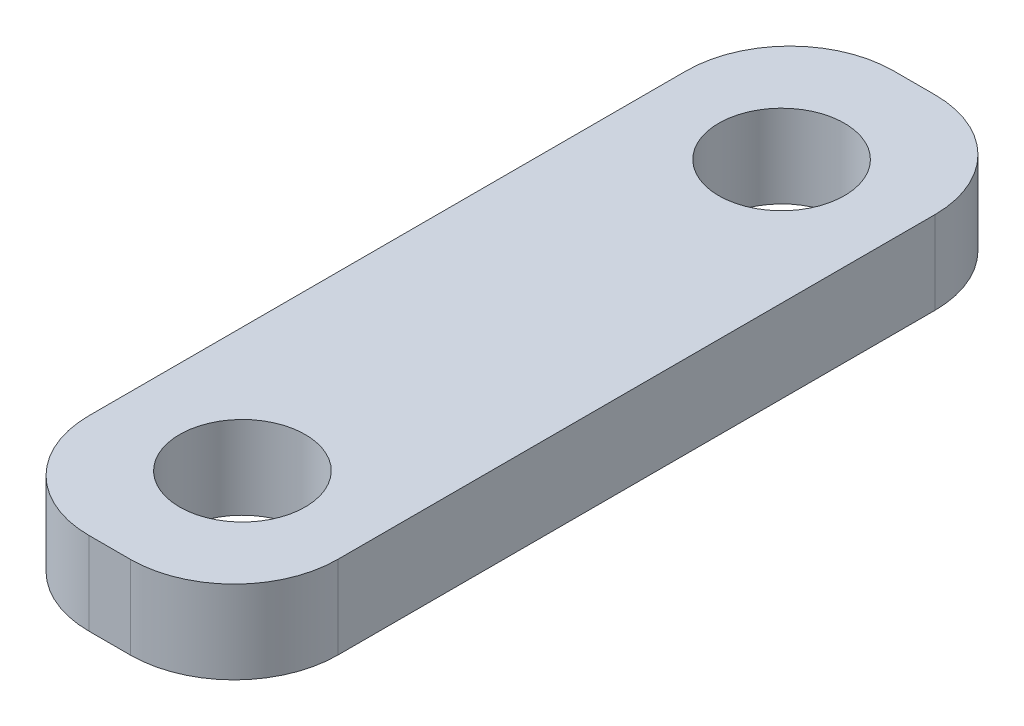
ISO-10303-21;
HEADER;
FILE_DESCRIPTION(('STEP AP214'),'2;1');
FILE_NAME('part.step','',(''),(''),'','','');
FILE_SCHEMA(('AUTOMOTIVE_DESIGN { 1 0 10303 214 1 1 1 1 }'));
ENDSEC;
DATA;
#1=APPLICATION_CONTEXT('core data for automotive mechanical design processes');
#2=APPLICATION_PROTOCOL_DEFINITION('international standard','automotive_design',2000,#1);
#3=PRODUCT_CONTEXT('',#1,'mechanical');
#4=PRODUCT('Part','Part','',(#3));
#5=PRODUCT_RELATED_PRODUCT_CATEGORY('part','',(#4));
#6=PRODUCT_DEFINITION_FORMATION('','',#4);
#7=PRODUCT_DEFINITION_CONTEXT('part definition',#1,'design');
#8=PRODUCT_DEFINITION('design','',#6,#7);
#9=PRODUCT_DEFINITION_SHAPE('','',#8);
#10=(LENGTH_UNIT() NAMED_UNIT(*) SI_UNIT(.MILLI.,.METRE.));
#11=(NAMED_UNIT(*) PLANE_ANGLE_UNIT() SI_UNIT($,.RADIAN.));
#12=(NAMED_UNIT(*) SI_UNIT($,.STERADIAN.) SOLID_ANGLE_UNIT());
#13=UNCERTAINTY_MEASURE_WITH_UNIT(LENGTH_MEASURE(1.E-05),#10,'distance_accuracy_value','');
#14=(GEOMETRIC_REPRESENTATION_CONTEXT(3) GLOBAL_UNCERTAINTY_ASSIGNED_CONTEXT((#13)) GLOBAL_UNIT_ASSIGNED_CONTEXT((#10,
#11,#12)) REPRESENTATION_CONTEXT('',''));
#15=CARTESIAN_POINT('',(0.,0.,0.));
#16=DIRECTION('',(0.,0.,1.));
#17=DIRECTION('',(1.,0.,0.));
#18=AXIS2_PLACEMENT_3D('',#15,#16,#17);
#19=CARTESIAN_POINT('',(0.,2.,0.));
#20=DIRECTION('',(0.,-1.,0.));
#21=DIRECTION('',(0.,0.,-1.));
#22=AXIS2_PLACEMENT_3D('',#19,#20,#21);
#23=PLANE('',#22);
#24=DIRECTION('',(1.,0.,0.));
#25=VECTOR('',#24,1.);
#26=CARTESIAN_POINT('',(0.,2.,0.));
#27=LINE('',#26,#25);
#28=CARTESIAN_POINT('',(2.5,2.,0.));
#29=VERTEX_POINT('',#28);
#30=CARTESIAN_POINT('',(3.5,2.,0.));
#31=VERTEX_POINT('',#30);
#32=EDGE_CURVE('E176',#29,#31,#27,.T.);
#33=ORIENTED_EDGE('',*,*,#32,.T.);
#34=CARTESIAN_POINT('',(3.5,2.,-2.5));
#35=DIRECTION('',(0.,-1.,0.));
#36=DIRECTION('',(0.,0.,-1.));
#37=AXIS2_PLACEMENT_3D('',#34,#35,#36);
#38=CIRCLE('',#37,2.5);
#39=CARTESIAN_POINT('',(6.,2.,-2.5));
#40=VERTEX_POINT('',#39);
#41=EDGE_CURVE('E156',#31,#40,#38,.F.);
#42=ORIENTED_EDGE('',*,*,#41,.T.);
#43=DIRECTION('',(0.,0.,-1.));
#44=VECTOR('',#43,1.);
#45=CARTESIAN_POINT('',(6.,2.,0.));
#46=LINE('',#45,#44);
#47=CARTESIAN_POINT('',(6.,2.,-16.9));
#48=VERTEX_POINT('',#47);
#49=EDGE_CURVE('E126',#40,#48,#46,.T.);
#50=ORIENTED_EDGE('',*,*,#49,.T.);
#51=CARTESIAN_POINT('',(3.5,2.,-16.9));
#52=DIRECTION('',(0.,-1.,0.));
#53=DIRECTION('',(0.,0.,-1.));
#54=AXIS2_PLACEMENT_3D('',#51,#52,#53);
#55=CIRCLE('',#54,2.5);
#56=CARTESIAN_POINT('',(3.5,2.,-19.4));
#57=VERTEX_POINT('',#56);
#58=EDGE_CURVE('E62',#48,#57,#55,.F.);
#59=ORIENTED_EDGE('',*,*,#58,.T.);
#60=DIRECTION('',(-1.,0.,0.));
#61=VECTOR('',#60,1.);
#62=CARTESIAN_POINT('',(0.,2.,-19.4));
#63=LINE('',#62,#61);
#64=CARTESIAN_POINT('',(2.5,2.,-19.4));
#65=VERTEX_POINT('',#64);
#66=EDGE_CURVE('E143',#57,#65,#63,.T.);
#67=ORIENTED_EDGE('',*,*,#66,.T.);
#68=CARTESIAN_POINT('',(2.5,2.,-16.9));
#69=DIRECTION('',(0.,-1.,0.));
#70=DIRECTION('',(0.,0.,-1.));
#71=AXIS2_PLACEMENT_3D('',#68,#69,#70);
#72=CIRCLE('',#71,2.5);
#73=CARTESIAN_POINT('',(0.,2.,-16.9));
#74=VERTEX_POINT('',#73);
#75=EDGE_CURVE('E151',#65,#74,#72,.F.);
#76=ORIENTED_EDGE('',*,*,#75,.T.);
#77=DIRECTION('',(0.,0.,1.));
#78=VECTOR('',#77,1.);
#79=CARTESIAN_POINT('',(0.,2.,0.));
#80=LINE('',#79,#78);
#81=CARTESIAN_POINT('',(0.,2.,-2.5));
#82=VERTEX_POINT('',#81);
#83=EDGE_CURVE('E137',#74,#82,#80,.T.);
#84=ORIENTED_EDGE('',*,*,#83,.T.);
#85=CARTESIAN_POINT('',(2.5,2.,-2.5));
#86=DIRECTION('',(0.,-1.,0.));
#87=DIRECTION('',(0.,0.,-1.));
#88=AXIS2_PLACEMENT_3D('',#85,#86,#87);
#89=CIRCLE('',#88,2.5);
#90=EDGE_CURVE('E154',#82,#29,#89,.F.);
#91=ORIENTED_EDGE('',*,*,#90,.T.);
#92=EDGE_LOOP('',(#33,#42,#50,#59,#67,#76,#84,#91));
#93=FACE_BOUND('',#92,.T.);
#94=CARTESIAN_POINT('',(3.,2.,-16.2));
#95=DIRECTION('',(0.,1.,0.));
#96=DIRECTION('',(0.,0.,1.));
#97=AXIS2_PLACEMENT_3D('',#94,#95,#96);
#98=CIRCLE('',#97,1.515);
#99=CARTESIAN_POINT('',(3.,2.,-14.685));
#100=VERTEX_POINT('',#99);
#101=EDGE_CURVE('E182',#100,#100,#98,.T.);
#102=ORIENTED_EDGE('',*,*,#101,.F.);
#103=EDGE_LOOP('',(#102));
#104=FACE_BOUND('',#103,.T.);
#105=CARTESIAN_POINT('',(3.,2.,-3.2));
#106=DIRECTION('',(0.,1.,0.));
#107=DIRECTION('',(0.,0.,1.));
#108=AXIS2_PLACEMENT_3D('',#105,#106,#107);
#109=CIRCLE('',#108,1.515);
#110=CARTESIAN_POINT('',(3.,2.,-1.685));
#111=VERTEX_POINT('',#110);
#112=EDGE_CURVE('E191',#111,#111,#109,.T.);
#113=ORIENTED_EDGE('',*,*,#112,.F.);
#114=EDGE_LOOP('',(#113));
#115=FACE_BOUND('',#114,.T.);
#116=ADVANCED_FACE('F41',(#93,#104,#115),#23,.F.);
#117=CARTESIAN_POINT('',(0.,0.,0.));
#118=DIRECTION('',(0.,-1.,0.));
#119=DIRECTION('',(0.,0.,-1.));
#120=AXIS2_PLACEMENT_3D('',#117,#118,#119);
#121=PLANE('',#120);
#122=CARTESIAN_POINT('',(3.,0.,-16.2));
#123=DIRECTION('',(0.,1.,0.));
#124=DIRECTION('',(0.,0.,1.));
#125=AXIS2_PLACEMENT_3D('',#122,#123,#124);
#126=CIRCLE('',#125,1.515);
#127=CARTESIAN_POINT('',(3.,0.,-14.685));
#128=VERTEX_POINT('',#127);
#129=EDGE_CURVE('E184',#128,#128,#126,.T.);
#130=ORIENTED_EDGE('',*,*,#129,.T.);
#131=EDGE_LOOP('',(#130));
#132=FACE_BOUND('',#131,.T.);
#133=DIRECTION('',(0.,0.,-1.));
#134=VECTOR('',#133,1.);
#135=CARTESIAN_POINT('',(6.,0.,0.));
#136=LINE('',#135,#134);
#137=CARTESIAN_POINT('',(6.,0.,-2.5));
#138=VERTEX_POINT('',#137);
#139=CARTESIAN_POINT('',(6.,0.,-16.9));
#140=VERTEX_POINT('',#139);
#141=EDGE_CURVE('E124',#138,#140,#136,.T.);
#142=ORIENTED_EDGE('',*,*,#141,.F.);
#143=CARTESIAN_POINT('',(3.5,0.,-2.5));
#144=DIRECTION('',(0.,-1.,0.));
#145=DIRECTION('',(0.,0.,-1.));
#146=AXIS2_PLACEMENT_3D('',#143,#144,#145);
#147=CIRCLE('',#146,2.5);
#148=CARTESIAN_POINT('',(3.5,0.,0.));
#149=VERTEX_POINT('',#148);
#150=EDGE_CURVE('E107',#138,#149,#147,.T.);
#151=ORIENTED_EDGE('',*,*,#150,.T.);
#152=DIRECTION('',(1.,0.,0.));
#153=VECTOR('',#152,1.);
#154=CARTESIAN_POINT('',(0.,0.,0.));
#155=LINE('',#154,#153);
#156=CARTESIAN_POINT('',(2.5,0.,0.));
#157=VERTEX_POINT('',#156);
#158=EDGE_CURVE('E135',#157,#149,#155,.T.);
#159=ORIENTED_EDGE('',*,*,#158,.F.);
#160=CARTESIAN_POINT('',(2.5,0.,-2.5));
#161=DIRECTION('',(0.,-1.,0.));
#162=DIRECTION('',(0.,0.,-1.));
#163=AXIS2_PLACEMENT_3D('',#160,#161,#162);
#164=CIRCLE('',#163,2.5);
#165=CARTESIAN_POINT('',(0.,0.,-2.5));
#166=VERTEX_POINT('',#165);
#167=EDGE_CURVE('E118',#157,#166,#164,.T.);
#168=ORIENTED_EDGE('',*,*,#167,.T.);
#169=DIRECTION('',(0.,0.,1.));
#170=VECTOR('',#169,1.);
#171=CARTESIAN_POINT('',(0.,0.,0.));
#172=LINE('',#171,#170);
#173=CARTESIAN_POINT('',(0.,0.,-16.9));
#174=VERTEX_POINT('',#173);
#175=EDGE_CURVE('E139',#174,#166,#172,.T.);
#176=ORIENTED_EDGE('',*,*,#175,.F.);
#177=CARTESIAN_POINT('',(2.5,0.,-16.9));
#178=DIRECTION('',(0.,-1.,0.));
#179=DIRECTION('',(0.,0.,-1.));
#180=AXIS2_PLACEMENT_3D('',#177,#178,#179);
#181=CIRCLE('',#180,2.5);
#182=CARTESIAN_POINT('',(2.5,0.,-19.4));
#183=VERTEX_POINT('',#182);
#184=EDGE_CURVE('E127',#174,#183,#181,.T.);
#185=ORIENTED_EDGE('',*,*,#184,.T.);
#186=DIRECTION('',(-1.,0.,0.));
#187=VECTOR('',#186,1.);
#188=CARTESIAN_POINT('',(0.,0.,-19.4));
#189=LINE('',#188,#187);
#190=CARTESIAN_POINT('',(3.5,0.,-19.4));
#191=VERTEX_POINT('',#190);
#192=EDGE_CURVE('E134',#191,#183,#189,.T.);
#193=ORIENTED_EDGE('',*,*,#192,.F.);
#194=CARTESIAN_POINT('',(3.5,0.,-16.9));
#195=DIRECTION('',(0.,-1.,0.));
#196=DIRECTION('',(0.,0.,-1.));
#197=AXIS2_PLACEMENT_3D('',#194,#195,#196);
#198=CIRCLE('',#197,2.5);
#199=EDGE_CURVE('E133',#191,#140,#198,.T.);
#200=ORIENTED_EDGE('',*,*,#199,.T.);
#201=EDGE_LOOP('',(#142,#151,#159,#168,#176,#185,#193,#200));
#202=FACE_BOUND('',#201,.T.);
#203=CARTESIAN_POINT('',(3.,0.,-3.2));
#204=DIRECTION('',(0.,1.,0.));
#205=DIRECTION('',(0.,0.,1.));
#206=AXIS2_PLACEMENT_3D('',#203,#204,#205);
#207=CIRCLE('',#206,1.515);
#208=CARTESIAN_POINT('',(3.,0.,-1.685));
#209=VERTEX_POINT('',#208);
#210=EDGE_CURVE('E193',#209,#209,#207,.T.);
#211=ORIENTED_EDGE('',*,*,#210,.T.);
#212=EDGE_LOOP('',(#211));
#213=FACE_BOUND('',#212,.T.);
#214=ADVANCED_FACE('F130',(#132,#202,#213),#121,.T.);
#215=CARTESIAN_POINT('',(0.,2.,0.));
#216=DIRECTION('',(1.,0.,0.));
#217=DIRECTION('',(0.,0.,-1.));
#218=AXIS2_PLACEMENT_3D('',#215,#216,#217);
#219=PLANE('',#218);
#220=ORIENTED_EDGE('',*,*,#175,.T.);
#221=DIRECTION('',(0.,-1.,0.));
#222=VECTOR('',#221,1.);
#223=CARTESIAN_POINT('',(0.,2.,-2.5));
#224=LINE('',#223,#222);
#225=EDGE_CURVE('E161',#166,#82,#224,.F.);
#226=ORIENTED_EDGE('',*,*,#225,.T.);
#227=ORIENTED_EDGE('',*,*,#83,.F.);
#228=DIRECTION('',(0.,-1.,0.));
#229=VECTOR('',#228,1.);
#230=CARTESIAN_POINT('',(0.,2.,-16.9));
#231=LINE('',#230,#229);
#232=EDGE_CURVE('E158',#74,#174,#231,.T.);
#233=ORIENTED_EDGE('',*,*,#232,.T.);
#234=EDGE_LOOP('',(#220,#226,#227,#233));
#235=FACE_BOUND('',#234,.T.);
#236=ADVANCED_FACE('F167',(#235),#219,.F.);
#237=CARTESIAN_POINT('',(0.,2.,0.));
#238=DIRECTION('',(0.,0.,-1.));
#239=DIRECTION('',(-1.,0.,0.));
#240=AXIS2_PLACEMENT_3D('',#237,#238,#239);
#241=PLANE('',#240);
#242=ORIENTED_EDGE('',*,*,#158,.T.);
#243=DIRECTION('',(0.,-1.,0.));
#244=VECTOR('',#243,1.);
#245=CARTESIAN_POINT('',(3.5,2.,0.));
#246=LINE('',#245,#244);
#247=EDGE_CURVE('E112',#149,#31,#246,.F.);
#248=ORIENTED_EDGE('',*,*,#247,.T.);
#249=ORIENTED_EDGE('',*,*,#32,.F.);
#250=DIRECTION('',(0.,-1.,0.));
#251=VECTOR('',#250,1.);
#252=CARTESIAN_POINT('',(2.5,2.,0.));
#253=LINE('',#252,#251);
#254=EDGE_CURVE('E117',#29,#157,#253,.T.);
#255=ORIENTED_EDGE('',*,*,#254,.T.);
#256=EDGE_LOOP('',(#242,#248,#249,#255));
#257=FACE_BOUND('',#256,.T.);
#258=ADVANCED_FACE('F181',(#257),#241,.F.);
#259=CARTESIAN_POINT('',(6.,2.,0.));
#260=DIRECTION('',(-1.,0.,0.));
#261=DIRECTION('',(0.,0.,1.));
#262=AXIS2_PLACEMENT_3D('',#259,#260,#261);
#263=PLANE('',#262);
#264=ORIENTED_EDGE('',*,*,#49,.F.);
#265=DIRECTION('',(0.,-1.,0.));
#266=VECTOR('',#265,1.);
#267=CARTESIAN_POINT('',(6.,2.,-2.5));
#268=LINE('',#267,#266);
#269=EDGE_CURVE('E111',#40,#138,#268,.T.);
#270=ORIENTED_EDGE('',*,*,#269,.T.);
#271=ORIENTED_EDGE('',*,*,#141,.T.);
#272=DIRECTION('',(0.,-1.,0.));
#273=VECTOR('',#272,1.);
#274=CARTESIAN_POINT('',(6.,2.,-16.9));
#275=LINE('',#274,#273);
#276=EDGE_CURVE('E128',#140,#48,#275,.F.);
#277=ORIENTED_EDGE('',*,*,#276,.T.);
#278=EDGE_LOOP('',(#264,#270,#271,#277));
#279=FACE_BOUND('',#278,.T.);
#280=ADVANCED_FACE('F123',(#279),#263,.F.);
#281=CARTESIAN_POINT('',(0.,2.,-19.4));
#282=DIRECTION('',(0.,0.,1.));
#283=DIRECTION('',(1.,0.,0.));
#284=AXIS2_PLACEMENT_3D('',#281,#282,#283);
#285=PLANE('',#284);
#286=ORIENTED_EDGE('',*,*,#66,.F.);
#287=DIRECTION('',(0.,-1.,0.));
#288=VECTOR('',#287,1.);
#289=CARTESIAN_POINT('',(3.5,2.,-19.4));
#290=LINE('',#289,#288);
#291=EDGE_CURVE('E11',#57,#191,#290,.T.);
#292=ORIENTED_EDGE('',*,*,#291,.T.);
#293=ORIENTED_EDGE('',*,*,#192,.T.);
#294=DIRECTION('',(0.,-1.,0.));
#295=VECTOR('',#294,1.);
#296=CARTESIAN_POINT('',(2.5,2.,-19.4));
#297=LINE('',#296,#295);
#298=EDGE_CURVE('E49',#183,#65,#297,.F.);
#299=ORIENTED_EDGE('',*,*,#298,.T.);
#300=EDGE_LOOP('',(#286,#292,#293,#299));
#301=FACE_BOUND('',#300,.T.);
#302=ADVANCED_FACE('F214',(#301),#285,.F.);
#303=CARTESIAN_POINT('',(3.,2.,-16.2));
#304=DIRECTION('',(0.,-1.,0.));
#305=DIRECTION('',(0.,0.,-1.));
#306=AXIS2_PLACEMENT_3D('',#303,#304,#305);
#307=CYLINDRICAL_SURFACE('',#306,1.515);
#308=ORIENTED_EDGE('',*,*,#101,.T.);
#309=EDGE_LOOP('',(#308));
#310=FACE_BOUND('',#309,.T.);
#311=ORIENTED_EDGE('',*,*,#129,.F.);
#312=EDGE_LOOP('',(#311));
#313=FACE_BOUND('',#312,.T.);
#314=ADVANCED_FACE('F211',(#310,#313),#307,.F.);
#315=CARTESIAN_POINT('',(3.,2.,-3.2));
#316=DIRECTION('',(0.,-1.,0.));
#317=DIRECTION('',(0.,0.,-1.));
#318=AXIS2_PLACEMENT_3D('',#315,#316,#317);
#319=CYLINDRICAL_SURFACE('',#318,1.515);
#320=ORIENTED_EDGE('',*,*,#112,.T.);
#321=EDGE_LOOP('',(#320));
#322=FACE_BOUND('',#321,.T.);
#323=ORIENTED_EDGE('',*,*,#210,.F.);
#324=EDGE_LOOP('',(#323));
#325=FACE_BOUND('',#324,.T.);
#326=ADVANCED_FACE('F199',(#322,#325),#319,.F.);
#327=CARTESIAN_POINT('',(3.5,2.,-2.5));
#328=DIRECTION('',(0.,-1.,0.));
#329=DIRECTION('',(0.,0.,-1.));
#330=AXIS2_PLACEMENT_3D('',#327,#328,#329);
#331=CYLINDRICAL_SURFACE('',#330,2.5);
#332=ORIENTED_EDGE('',*,*,#41,.F.);
#333=ORIENTED_EDGE('',*,*,#247,.F.);
#334=ORIENTED_EDGE('',*,*,#150,.F.);
#335=ORIENTED_EDGE('',*,*,#269,.F.);
#336=EDGE_LOOP('',(#332,#333,#334,#335));
#337=FACE_BOUND('',#336,.T.);
#338=ADVANCED_FACE('F110',(#337),#331,.T.);
#339=CARTESIAN_POINT('',(2.5,2.,-2.5));
#340=DIRECTION('',(0.,-1.,0.));
#341=DIRECTION('',(0.,0.,-1.));
#342=AXIS2_PLACEMENT_3D('',#339,#340,#341);
#343=CYLINDRICAL_SURFACE('',#342,2.5);
#344=ORIENTED_EDGE('',*,*,#90,.F.);
#345=ORIENTED_EDGE('',*,*,#225,.F.);
#346=ORIENTED_EDGE('',*,*,#167,.F.);
#347=ORIENTED_EDGE('',*,*,#254,.F.);
#348=EDGE_LOOP('',(#344,#345,#346,#347));
#349=FACE_BOUND('',#348,.T.);
#350=ADVANCED_FACE('F179',(#349),#343,.T.);
#351=CARTESIAN_POINT('',(3.5,2.,-16.9));
#352=DIRECTION('',(0.,-1.,0.));
#353=DIRECTION('',(0.,0.,-1.));
#354=AXIS2_PLACEMENT_3D('',#351,#352,#353);
#355=CYLINDRICAL_SURFACE('',#354,2.5);
#356=ORIENTED_EDGE('',*,*,#58,.F.);
#357=ORIENTED_EDGE('',*,*,#276,.F.);
#358=ORIENTED_EDGE('',*,*,#199,.F.);
#359=ORIENTED_EDGE('',*,*,#291,.F.);
#360=EDGE_LOOP('',(#356,#357,#358,#359));
#361=FACE_BOUND('',#360,.T.);
#362=ADVANCED_FACE('F226',(#361),#355,.T.);
#363=CARTESIAN_POINT('',(2.5,2.,-16.9));
#364=DIRECTION('',(0.,-1.,0.));
#365=DIRECTION('',(0.,0.,-1.));
#366=AXIS2_PLACEMENT_3D('',#363,#364,#365);
#367=CYLINDRICAL_SURFACE('',#366,2.5);
#368=ORIENTED_EDGE('',*,*,#75,.F.);
#369=ORIENTED_EDGE('',*,*,#298,.F.);
#370=ORIENTED_EDGE('',*,*,#184,.F.);
#371=ORIENTED_EDGE('',*,*,#232,.F.);
#372=EDGE_LOOP('',(#368,#369,#370,#371));
#373=FACE_BOUND('',#372,.T.);
#374=ADVANCED_FACE('F43',(#373),#367,.T.);
#375=CLOSED_SHELL('',(#116,#214,#236,#258,#280,#302,#314,#326,#338,#350,#362,#374));
#376=MANIFOLD_SOLID_BREP('B2',#375);
#377=ADVANCED_BREP_SHAPE_REPRESENTATION('',(#18,#376),#14);
#378=SHAPE_DEFINITION_REPRESENTATION(#9,#377);
ENDSEC;
END-ISO-10303-21;
